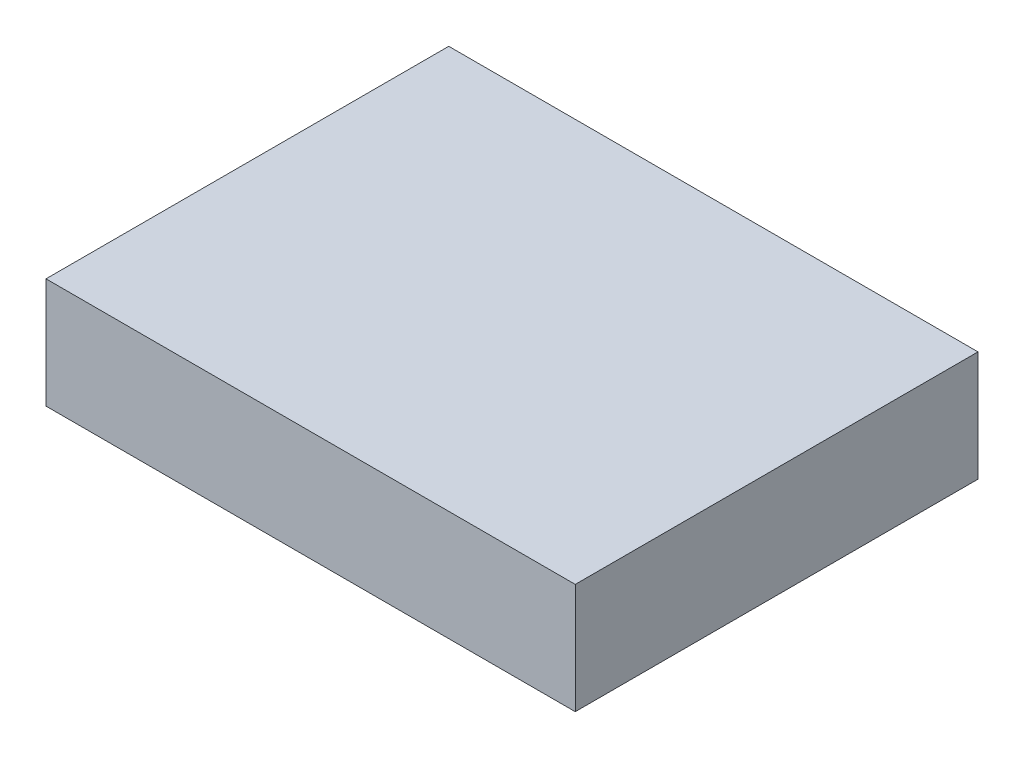
ISO-10303-21;
HEADER;
FILE_DESCRIPTION(('STEP AP214'),'2;1');
FILE_NAME('part.step','',(''),(''),'','','');
FILE_SCHEMA(('AUTOMOTIVE_DESIGN { 1 0 10303 214 1 1 1 1 }'));
ENDSEC;
DATA;
#1=APPLICATION_CONTEXT('core data for automotive mechanical design processes');
#2=APPLICATION_PROTOCOL_DEFINITION('international standard','automotive_design',2000,#1);
#3=PRODUCT_CONTEXT('',#1,'mechanical');
#4=PRODUCT('Part','Part','',(#3));
#5=PRODUCT_RELATED_PRODUCT_CATEGORY('part','',(#4));
#6=PRODUCT_DEFINITION_FORMATION('','',#4);
#7=PRODUCT_DEFINITION_CONTEXT('part definition',#1,'design');
#8=PRODUCT_DEFINITION('design','',#6,#7);
#9=PRODUCT_DEFINITION_SHAPE('','',#8);
#10=(LENGTH_UNIT() NAMED_UNIT(*) SI_UNIT(.MILLI.,.METRE.));
#11=(NAMED_UNIT(*) PLANE_ANGLE_UNIT() SI_UNIT($,.RADIAN.));
#12=(NAMED_UNIT(*) SI_UNIT($,.STERADIAN.) SOLID_ANGLE_UNIT());
#13=UNCERTAINTY_MEASURE_WITH_UNIT(LENGTH_MEASURE(1.E-05),#10,'distance_accuracy_value','');
#14=(GEOMETRIC_REPRESENTATION_CONTEXT(3) GLOBAL_UNCERTAINTY_ASSIGNED_CONTEXT((#13)) GLOBAL_UNIT_ASSIGNED_CONTEXT((#10,
#11,#12)) REPRESENTATION_CONTEXT('',''));
#15=CARTESIAN_POINT('',(0.,0.,0.));
#16=DIRECTION('',(0.,0.,1.));
#17=DIRECTION('',(1.,0.,0.));
#18=AXIS2_PLACEMENT_3D('',#15,#16,#17);
#19=CARTESIAN_POINT('',(22.8,9.5,17.35));
#20=DIRECTION('',(-1.,0.,0.));
#21=DIRECTION('',(0.,0.,1.));
#22=AXIS2_PLACEMENT_3D('',#19,#20,#21);
#23=PLANE('',#22);
#24=DIRECTION('',(0.,0.,-1.));
#25=VECTOR('',#24,1.);
#26=CARTESIAN_POINT('',(22.8,0.,17.35));
#27=LINE('',#26,#25);
#28=CARTESIAN_POINT('',(22.8,0.,17.35));
#29=VERTEX_POINT('',#28);
#30=CARTESIAN_POINT('',(22.8,0.,-17.35));
#31=VERTEX_POINT('',#30);
#32=EDGE_CURVE('E109',#29,#31,#27,.T.);
#33=ORIENTED_EDGE('',*,*,#32,.T.);
#34=DIRECTION('',(0.,-1.,0.));
#35=VECTOR('',#34,1.);
#36=CARTESIAN_POINT('',(22.8,9.5,-17.35));
#37=LINE('',#36,#35);
#38=CARTESIAN_POINT('',(22.8,9.5,-17.35));
#39=VERTEX_POINT('',#38);
#40=EDGE_CURVE('E11',#39,#31,#37,.T.);
#41=ORIENTED_EDGE('',*,*,#40,.F.);
#42=DIRECTION('',(0.,0.,-1.));
#43=VECTOR('',#42,1.);
#44=CARTESIAN_POINT('',(22.8,9.5,17.35));
#45=LINE('',#44,#43);
#46=CARTESIAN_POINT('',(22.8,9.5,17.35));
#47=VERTEX_POINT('',#46);
#48=EDGE_CURVE('E93',#47,#39,#45,.T.);
#49=ORIENTED_EDGE('',*,*,#48,.F.);
#50=DIRECTION('',(0.,-1.,0.));
#51=VECTOR('',#50,1.);
#52=CARTESIAN_POINT('',(22.8,9.5,17.35));
#53=LINE('',#52,#51);
#54=EDGE_CURVE('E105',#47,#29,#53,.T.);
#55=ORIENTED_EDGE('',*,*,#54,.T.);
#56=EDGE_LOOP('',(#33,#41,#49,#55));
#57=FACE_BOUND('',#56,.T.);
#58=ADVANCED_FACE('F41',(#57),#23,.F.);
#59=CARTESIAN_POINT('',(-22.8,9.5,-17.35));
#60=DIRECTION('',(0.,0.,1.));
#61=DIRECTION('',(1.,0.,0.));
#62=AXIS2_PLACEMENT_3D('',#59,#60,#61);
#63=PLANE('',#62);
#64=DIRECTION('',(-1.,0.,0.));
#65=VECTOR('',#64,1.);
#66=CARTESIAN_POINT('',(-22.8,0.,-17.35));
#67=LINE('',#66,#65);
#68=CARTESIAN_POINT('',(-22.8,0.,-17.35));
#69=VERTEX_POINT('',#68);
#70=EDGE_CURVE('E98',#31,#69,#67,.T.);
#71=ORIENTED_EDGE('',*,*,#70,.T.);
#72=DIRECTION('',(0.,-1.,0.));
#73=VECTOR('',#72,1.);
#74=CARTESIAN_POINT('',(-22.8,9.5,-17.35));
#75=LINE('',#74,#73);
#76=CARTESIAN_POINT('',(-22.8,9.5,-17.35));
#77=VERTEX_POINT('',#76);
#78=EDGE_CURVE('E50',#77,#69,#75,.T.);
#79=ORIENTED_EDGE('',*,*,#78,.F.);
#80=DIRECTION('',(-1.,0.,0.));
#81=VECTOR('',#80,1.);
#82=CARTESIAN_POINT('',(-22.8,9.5,-17.35));
#83=LINE('',#82,#81);
#84=EDGE_CURVE('E88',#39,#77,#83,.T.);
#85=ORIENTED_EDGE('',*,*,#84,.F.);
#86=ORIENTED_EDGE('',*,*,#40,.T.);
#87=EDGE_LOOP('',(#71,#79,#85,#86));
#88=FACE_BOUND('',#87,.T.);
#89=ADVANCED_FACE('F97',(#88),#63,.F.);
#90=CARTESIAN_POINT('',(-22.8,9.5,17.35));
#91=DIRECTION('',(1.,0.,0.));
#92=DIRECTION('',(0.,0.,-1.));
#93=AXIS2_PLACEMENT_3D('',#90,#91,#92);
#94=PLANE('',#93);
#95=DIRECTION('',(0.,0.,1.));
#96=VECTOR('',#95,1.);
#97=CARTESIAN_POINT('',(-22.8,0.,17.35));
#98=LINE('',#97,#96);
#99=CARTESIAN_POINT('',(-22.8,0.,17.35));
#100=VERTEX_POINT('',#99);
#101=EDGE_CURVE('E75',#69,#100,#98,.T.);
#102=ORIENTED_EDGE('',*,*,#101,.T.);
#103=DIRECTION('',(0.,-1.,0.));
#104=VECTOR('',#103,1.);
#105=CARTESIAN_POINT('',(-22.8,9.5,17.35));
#106=LINE('',#105,#104);
#107=CARTESIAN_POINT('',(-22.8,9.5,17.35));
#108=VERTEX_POINT('',#107);
#109=EDGE_CURVE('E100',#108,#100,#106,.T.);
#110=ORIENTED_EDGE('',*,*,#109,.F.);
#111=DIRECTION('',(0.,0.,1.));
#112=VECTOR('',#111,1.);
#113=CARTESIAN_POINT('',(-22.8,9.5,17.35));
#114=LINE('',#113,#112);
#115=EDGE_CURVE('E91',#77,#108,#114,.T.);
#116=ORIENTED_EDGE('',*,*,#115,.F.);
#117=ORIENTED_EDGE('',*,*,#78,.T.);
#118=EDGE_LOOP('',(#102,#110,#116,#117));
#119=FACE_BOUND('',#118,.T.);
#120=ADVANCED_FACE('F101',(#119),#94,.F.);
#121=CARTESIAN_POINT('',(-22.8,9.5,17.35));
#122=DIRECTION('',(0.,0.,-1.));
#123=DIRECTION('',(-1.,0.,0.));
#124=AXIS2_PLACEMENT_3D('',#121,#122,#123);
#125=PLANE('',#124);
#126=DIRECTION('',(1.,0.,0.));
#127=VECTOR('',#126,1.);
#128=CARTESIAN_POINT('',(-22.8,0.,17.35));
#129=LINE('',#128,#127);
#130=EDGE_CURVE('E81',#100,#29,#129,.T.);
#131=ORIENTED_EDGE('',*,*,#130,.T.);
#132=ORIENTED_EDGE('',*,*,#54,.F.);
#133=DIRECTION('',(1.,0.,0.));
#134=VECTOR('',#133,1.);
#135=CARTESIAN_POINT('',(-22.8,9.5,17.35));
#136=LINE('',#135,#134);
#137=EDGE_CURVE('E58',#108,#47,#136,.T.);
#138=ORIENTED_EDGE('',*,*,#137,.F.);
#139=ORIENTED_EDGE('',*,*,#109,.T.);
#140=EDGE_LOOP('',(#131,#132,#138,#139));
#141=FACE_BOUND('',#140,.T.);
#142=ADVANCED_FACE('F122',(#141),#125,.F.);
#143=CARTESIAN_POINT('',(0.,9.5,0.));
#144=DIRECTION('',(0.,-1.,0.));
#145=DIRECTION('',(0.,0.,-1.));
#146=AXIS2_PLACEMENT_3D('',#143,#144,#145);
#147=PLANE('',#146);
#148=ORIENTED_EDGE('',*,*,#48,.T.);
#149=ORIENTED_EDGE('',*,*,#84,.T.);
#150=ORIENTED_EDGE('',*,*,#115,.T.);
#151=ORIENTED_EDGE('',*,*,#137,.T.);
#152=EDGE_LOOP('',(#148,#149,#150,#151));
#153=FACE_BOUND('',#152,.T.);
#154=ADVANCED_FACE('F89',(#153),#147,.F.);
#155=CARTESIAN_POINT('',(0.,0.,0.));
#156=DIRECTION('',(0.,-1.,0.));
#157=DIRECTION('',(0.,0.,-1.));
#158=AXIS2_PLACEMENT_3D('',#155,#156,#157);
#159=PLANE('',#158);
#160=ORIENTED_EDGE('',*,*,#32,.F.);
#161=ORIENTED_EDGE('',*,*,#130,.F.);
#162=ORIENTED_EDGE('',*,*,#101,.F.);
#163=ORIENTED_EDGE('',*,*,#70,.F.);
#164=EDGE_LOOP('',(#160,#161,#162,#163));
#165=FACE_BOUND('',#164,.T.);
#166=ADVANCED_FACE('F125',(#165),#159,.T.);
#167=CLOSED_SHELL('',(#58,#89,#120,#142,#154,#166));
#168=MANIFOLD_SOLID_BREP('B2',#167);
#169=ADVANCED_BREP_SHAPE_REPRESENTATION('',(#18,#168),#14);
#170=SHAPE_DEFINITION_REPRESENTATION(#9,#169);
ENDSEC;
END-ISO-10303-21;
